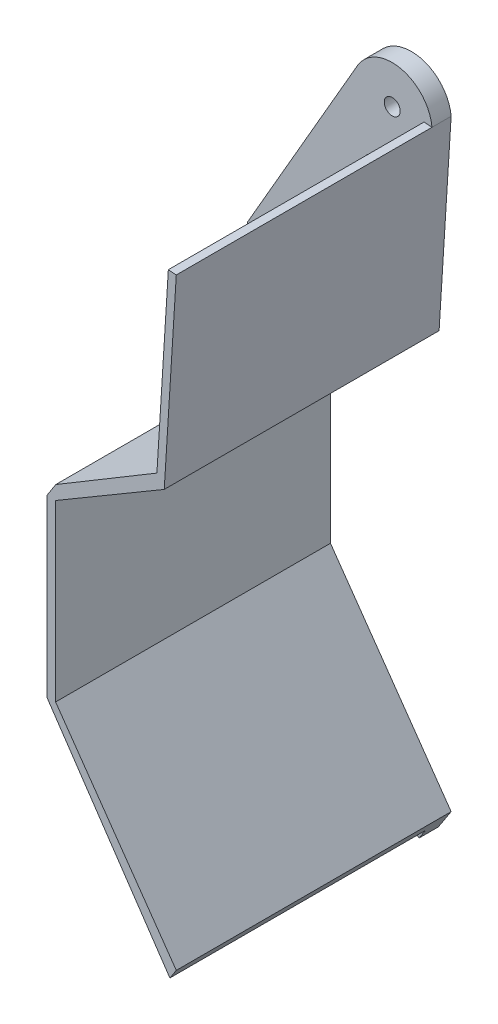
ISO-10303-21;
HEADER;
FILE_DESCRIPTION(('STEP AP214'),'2;1');
FILE_NAME('part.step','',(''),(''),'','','');
FILE_SCHEMA(('AUTOMOTIVE_DESIGN { 1 0 10303 214 1 1 1 1 }'));
ENDSEC;
DATA;
#1=APPLICATION_CONTEXT('core data for automotive mechanical design processes');
#2=APPLICATION_PROTOCOL_DEFINITION('international standard','automotive_design',2000,#1);
#3=PRODUCT_CONTEXT('',#1,'mechanical');
#4=PRODUCT('Part','Part','',(#3));
#5=PRODUCT_RELATED_PRODUCT_CATEGORY('part','',(#4));
#6=PRODUCT_DEFINITION_FORMATION('','',#4);
#7=PRODUCT_DEFINITION_CONTEXT('part definition',#1,'design');
#8=PRODUCT_DEFINITION('design','',#6,#7);
#9=PRODUCT_DEFINITION_SHAPE('','',#8);
#10=(LENGTH_UNIT() NAMED_UNIT(*) SI_UNIT(.MILLI.,.METRE.));
#11=(NAMED_UNIT(*) PLANE_ANGLE_UNIT() SI_UNIT($,.RADIAN.));
#12=(NAMED_UNIT(*) SI_UNIT($,.STERADIAN.) SOLID_ANGLE_UNIT());
#13=UNCERTAINTY_MEASURE_WITH_UNIT(LENGTH_MEASURE(1.E-05),#10,'distance_accuracy_value','');
#14=(GEOMETRIC_REPRESENTATION_CONTEXT(3) GLOBAL_UNCERTAINTY_ASSIGNED_CONTEXT((#13)) GLOBAL_UNIT_ASSIGNED_CONTEXT((#10,
#11,#12)) REPRESENTATION_CONTEXT('',''));
#15=CARTESIAN_POINT('',(0.,0.,0.));
#16=DIRECTION('',(0.,0.,1.));
#17=DIRECTION('',(1.,0.,0.));
#18=AXIS2_PLACEMENT_3D('',#15,#16,#17);
#19=CARTESIAN_POINT('',(0.,0.,3.));
#20=DIRECTION('',(0.,0.,1.));
#21=DIRECTION('',(1.,0.,0.));
#22=AXIS2_PLACEMENT_3D('',#19,#20,#21);
#23=PLANE('',#22);
#24=CARTESIAN_POINT('',(2.59169776383635,54.4046006028755,3.));
#25=DIRECTION('',(0.,0.,1.));
#26=DIRECTION('',(1.,0.,0.));
#27=AXIS2_PLACEMENT_3D('',#24,#25,#26);
#28=CIRCLE('',#27,1.25);
#29=CARTESIAN_POINT('',(3.84169776383635,54.4046006028755,3.));
#30=VERTEX_POINT('',#29);
#31=EDGE_CURVE('E330',#30,#30,#28,.T.);
#32=ORIENTED_EDGE('',*,*,#31,.F.);
#33=EDGE_LOOP('',(#32));
#34=FACE_BOUND('',#33,.T.);
#35=CARTESIAN_POINT('',(5.7844226517787,63.8812301614218,3.));
#36=DIRECTION('',(0.,0.,1.));
#37=DIRECTION('',(1.,0.,0.));
#38=AXIS2_PLACEMENT_3D('',#35,#36,#37);
#39=CIRCLE('',#38,1.25);
#40=CARTESIAN_POINT('',(7.0344226517787,63.8812301614218,3.));
#41=VERTEX_POINT('',#40);
#42=EDGE_CURVE('E341',#41,#41,#39,.T.);
#43=ORIENTED_EDGE('',*,*,#42,.F.);
#44=EDGE_LOOP('',(#43));
#45=FACE_BOUND('',#44,.T.);
#46=DIRECTION('',(-0.0627724838499412,-0.998027862973429,0.));
#47=VECTOR('',#46,1.);
#48=CARTESIAN_POINT('',(8.96652668410229,35.8285484730478,3.));
#49=LINE('',#48,#47);
#50=CARTESIAN_POINT('',(10.7560941355182,64.2811135085977,3.));
#51=VERTEX_POINT('',#50);
#52=CARTESIAN_POINT('',(8.96652668410229,35.8285484730478,3.));
#53=VERTEX_POINT('',#52);
#54=EDGE_CURVE('E52',#51,#53,#49,.T.);
#55=ORIENTED_EDGE('',*,*,#54,.F.);
#56=DIRECTION('',(-0.997367941462807,0.0725064779329624,0.));
#57=VECTOR('',#56,1.);
#58=CARTESIAN_POINT('',(10.7560941355182,64.2811135085977,3.));
#59=LINE('',#58,#57);
#60=CARTESIAN_POINT('',(11.9997557720586,64.1907020152488,3.));
#61=VERTEX_POINT('',#60);
#62=EDGE_CURVE('E328',#61,#51,#59,.T.);
#63=ORIENTED_EDGE('',*,*,#62,.F.);
#64=CARTESIAN_POINT('',(5.76690652211303,63.6033246271349,3.));
#65=DIRECTION('',(0.,0.,1.));
#66=DIRECTION('',(1.,0.,0.));
#67=AXIS2_PLACEMENT_3D('',#64,#65,#66);
#68=CIRCLE('',#67,6.26046499619758);
#69=CARTESIAN_POINT('',(0.441332655320446,66.8944771544346,3.));
#70=VERTEX_POINT('',#69);
#71=EDGE_CURVE('E225',#70,#61,#68,.F.);
#72=ORIENTED_EDGE('',*,*,#71,.F.);
#73=DIRECTION('',(-0.500000000000001,-0.866025403784438,0.));
#74=VECTOR('',#73,1.);
#75=CARTESIAN_POINT('',(-28.6351588028188,16.5325166430951,3.));
#76=LINE('',#75,#74);
#77=CARTESIAN_POINT('',(-16.8791754203684,36.8944771544346,3.));
#78=VERTEX_POINT('',#77);
#79=EDGE_CURVE('E228',#70,#78,#76,.T.);
#80=ORIENTED_EDGE('',*,*,#79,.T.);
#81=DIRECTION('',(0.,-1.,0.));
#82=VECTOR('',#81,1.);
#83=CARTESIAN_POINT('',(-16.8791754203684,0.,3.));
#84=LINE('',#83,#82);
#85=CARTESIAN_POINT('',(-16.8791754203684,-3.10552284556541,3.));
#86=VERTEX_POINT('',#85);
#87=EDGE_CURVE('E231',#78,#86,#84,.T.);
#88=ORIENTED_EDGE('',*,*,#87,.T.);
#89=DIRECTION('',(0.500000000000001,-0.866025403784438,0.));
#90=VECTOR('',#89,1.);
#91=CARTESIAN_POINT('',(-14.0041124034225,-8.08527806587781,3.));
#92=LINE('',#91,#90);
#93=CARTESIAN_POINT('',(-5.3321700365758,-23.1055228455654,3.));
#94=VERTEX_POINT('',#93);
#95=EDGE_CURVE('E233',#86,#94,#92,.T.);
#96=ORIENTED_EDGE('',*,*,#95,.T.);
#97=DIRECTION('',(0.837473233252394,-0.546478346859033,0.));
#98=VECTOR('',#97,1.);
#99=CARTESIAN_POINT('',(-12.166888121993,-18.6456484373278,3.));
#100=LINE('',#99,#98);
#101=CARTESIAN_POINT('',(9.99274151876576,-33.1055228455654,3.));
#102=VERTEX_POINT('',#101);
#103=EDGE_CURVE('E235',#94,#102,#100,.T.);
#104=ORIENTED_EDGE('',*,*,#103,.T.);
#105=DIRECTION('',(-0.546478346859033,-0.837473233252394,0.));
#106=VECTOR('',#105,1.);
#107=CARTESIAN_POINT('',(22.1596296407588,-14.4598744082376,3.));
#108=LINE('',#107,#106);
#109=CARTESIAN_POINT('',(10.9962486454122,-31.5676570494642,3.));
#110=VERTEX_POINT('',#109);
#111=EDGE_CURVE('E238',#110,#102,#108,.T.);
#112=ORIENTED_EDGE('',*,*,#111,.F.);
#113=DIRECTION('',(0.560666801625377,-0.828041507145125,0.));
#114=VECTOR('',#113,1.);
#115=CARTESIAN_POINT('',(-7.11584674073575,-4.81813894419358,3.));
#116=LINE('',#115,#114);
#117=CARTESIAN_POINT('',(-8.24840054145359,-3.14548496619693,3.));
#118=VERTEX_POINT('',#117);
#119=EDGE_CURVE('E215',#118,#110,#116,.T.);
#120=ORIENTED_EDGE('',*,*,#119,.F.);
#121=DIRECTION('',(0.,-1.,0.));
#122=VECTOR('',#121,1.);
#123=CARTESIAN_POINT('',(-8.24840054145359,0.,3.));
#124=LINE('',#123,#122);
#125=CARTESIAN_POINT('',(-8.24840054145359,24.1907020152488,3.));
#126=VERTEX_POINT('',#125);
#127=EDGE_CURVE('E222',#126,#118,#124,.T.);
#128=ORIENTED_EDGE('',*,*,#127,.F.);
#129=DIRECTION('',(-0.539017906216174,-0.842294305322274,0.));
#130=VECTOR('',#129,1.);
#131=CARTESIAN_POINT('',(-8.24840054145359,24.1907020152488,3.));
#132=LINE('',#131,#130);
#133=CARTESIAN_POINT('',(-6.85884455617702,26.3620864531816,3.));
#134=VERTEX_POINT('',#133);
#135=EDGE_CURVE('E59',#134,#126,#132,.T.);
#136=ORIENTED_EDGE('',*,*,#135,.F.);
#137=DIRECTION('',(-0.858180235420516,-0.513348501053219,0.));
#138=VECTOR('',#137,1.);
#139=CARTESIAN_POINT('',(-6.85884455617702,26.3620864531816,3.));
#140=LINE('',#139,#138);
#141=EDGE_CURVE('E186',#53,#134,#140,.T.);
#142=ORIENTED_EDGE('',*,*,#141,.F.);
#143=EDGE_LOOP('',(#55,#63,#72,#80,#88,#96,#104,#112,#120,#128,#136,#142));
#144=FACE_BOUND('',#143,.T.);
#145=ADVANCED_FACE('F37',(#34,#45,#144),#23,.T.);
#146=CARTESIAN_POINT('',(5.76690652211303,63.6033246271349,3.));
#147=DIRECTION('',(0.,0.,-1.));
#148=DIRECTION('',(-1.,0.,0.));
#149=AXIS2_PLACEMENT_3D('',#146,#147,#148);
#150=CYLINDRICAL_SURFACE('',#149,6.26046499619758);
#151=CARTESIAN_POINT('',(5.76690652211303,63.6033246271349,0.));
#152=DIRECTION('',(0.,0.,1.));
#153=DIRECTION('',(1.,0.,0.));
#154=AXIS2_PLACEMENT_3D('',#151,#152,#153);
#155=CIRCLE('',#154,6.26046499619758);
#156=CARTESIAN_POINT('',(0.441332655320446,66.8944771544346,0.));
#157=VERTEX_POINT('',#156);
#158=CARTESIAN_POINT('',(11.9997557720586,64.1907020152488,0.));
#159=VERTEX_POINT('',#158);
#160=EDGE_CURVE('E224',#157,#159,#155,.F.);
#161=ORIENTED_EDGE('',*,*,#160,.F.);
#162=DIRECTION('',(0.,0.,-1.));
#163=VECTOR('',#162,1.);
#164=CARTESIAN_POINT('',(0.441332655320446,66.8944771544346,3.));
#165=LINE('',#164,#163);
#166=EDGE_CURVE('E11',#70,#157,#165,.T.);
#167=ORIENTED_EDGE('',*,*,#166,.F.);
#168=ORIENTED_EDGE('',*,*,#71,.T.);
#169=DIRECTION('',(0.,0.,-1.));
#170=VECTOR('',#169,1.);
#171=CARTESIAN_POINT('',(11.9997557720586,64.1907020152488,3.));
#172=LINE('',#171,#170);
#173=EDGE_CURVE('E166',#61,#159,#172,.T.);
#174=ORIENTED_EDGE('',*,*,#173,.T.);
#175=EDGE_LOOP('',(#161,#167,#168,#174));
#176=FACE_BOUND('',#175,.T.);
#177=ADVANCED_FACE('F39',(#176),#150,.T.);
#178=CARTESIAN_POINT('',(-28.6351588028188,16.5325166430951,3.));
#179=DIRECTION('',(0.866025403784438,-0.500000000000001,0.));
#180=DIRECTION('',(0.500000000000001,0.866025403784438,0.));
#181=AXIS2_PLACEMENT_3D('',#178,#179,#180);
#182=PLANE('',#181);
#183=DIRECTION('',(-0.500000000000001,-0.866025403784438,0.));
#184=VECTOR('',#183,1.);
#185=CARTESIAN_POINT('',(-28.6351588028188,16.5325166430951,0.));
#186=LINE('',#185,#184);
#187=CARTESIAN_POINT('',(-16.8791754203684,36.8944771544346,0.));
#188=VERTEX_POINT('',#187);
#189=EDGE_CURVE('E242',#157,#188,#186,.T.);
#190=ORIENTED_EDGE('',*,*,#189,.T.);
#191=DIRECTION('',(0.,0.,-1.));
#192=VECTOR('',#191,1.);
#193=CARTESIAN_POINT('',(-16.8791754203684,36.8944771544346,3.));
#194=LINE('',#193,#192);
#195=EDGE_CURVE('E45',#78,#188,#194,.T.);
#196=ORIENTED_EDGE('',*,*,#195,.F.);
#197=ORIENTED_EDGE('',*,*,#79,.F.);
#198=ORIENTED_EDGE('',*,*,#166,.T.);
#199=EDGE_LOOP('',(#190,#196,#197,#198));
#200=FACE_BOUND('',#199,.T.);
#201=ADVANCED_FACE('F302',(#200),#182,.F.);
#202=CARTESIAN_POINT('',(-16.8791754203684,0.,3.));
#203=DIRECTION('',(1.,0.,0.));
#204=DIRECTION('',(0.,1.,0.));
#205=AXIS2_PLACEMENT_3D('',#202,#203,#204);
#206=PLANE('',#205);
#207=DIRECTION('',(0.,-1.,0.));
#208=VECTOR('',#207,1.);
#209=CARTESIAN_POINT('',(-16.8791754203684,0.,0.));
#210=LINE('',#209,#208);
#211=CARTESIAN_POINT('',(-16.8791754203684,-3.10552284556541,0.));
#212=VERTEX_POINT('',#211);
#213=EDGE_CURVE('E244',#188,#212,#210,.T.);
#214=ORIENTED_EDGE('',*,*,#213,.T.);
#215=DIRECTION('',(0.,0.,-1.));
#216=VECTOR('',#215,1.);
#217=CARTESIAN_POINT('',(-16.8791754203684,-3.10552284556541,3.));
#218=LINE('',#217,#216);
#219=EDGE_CURVE('E273',#86,#212,#218,.T.);
#220=ORIENTED_EDGE('',*,*,#219,.F.);
#221=ORIENTED_EDGE('',*,*,#87,.F.);
#222=ORIENTED_EDGE('',*,*,#195,.T.);
#223=EDGE_LOOP('',(#214,#220,#221,#222));
#224=FACE_BOUND('',#223,.T.);
#225=ADVANCED_FACE('F280',(#224),#206,.F.);
#226=CARTESIAN_POINT('',(-14.0041124034225,-8.08527806587781,3.));
#227=DIRECTION('',(0.866025403784438,0.500000000000001,0.));
#228=DIRECTION('',(-0.500000000000001,0.866025403784438,0.));
#229=AXIS2_PLACEMENT_3D('',#226,#227,#228);
#230=PLANE('',#229);
#231=DIRECTION('',(0.500000000000001,-0.866025403784438,0.));
#232=VECTOR('',#231,1.);
#233=CARTESIAN_POINT('',(-14.0041124034225,-8.08527806587781,0.));
#234=LINE('',#233,#232);
#235=CARTESIAN_POINT('',(-5.3321700365758,-23.1055228455654,0.));
#236=VERTEX_POINT('',#235);
#237=EDGE_CURVE('E246',#212,#236,#234,.T.);
#238=ORIENTED_EDGE('',*,*,#237,.T.);
#239=DIRECTION('',(0.,0.,-1.));
#240=VECTOR('',#239,1.);
#241=CARTESIAN_POINT('',(-5.3321700365758,-23.1055228455654,3.));
#242=LINE('',#241,#240);
#243=EDGE_CURVE('E270',#94,#236,#242,.T.);
#244=ORIENTED_EDGE('',*,*,#243,.F.);
#245=ORIENTED_EDGE('',*,*,#95,.F.);
#246=ORIENTED_EDGE('',*,*,#219,.T.);
#247=EDGE_LOOP('',(#238,#244,#245,#246));
#248=FACE_BOUND('',#247,.T.);
#249=ADVANCED_FACE('F292',(#248),#230,.F.);
#250=CARTESIAN_POINT('',(-12.166888121993,-18.6456484373278,3.));
#251=DIRECTION('',(0.546478346859033,0.837473233252394,0.));
#252=DIRECTION('',(-0.837473233252394,0.546478346859033,0.));
#253=AXIS2_PLACEMENT_3D('',#250,#251,#252);
#254=PLANE('',#253);
#255=DIRECTION('',(0.837473233252394,-0.546478346859033,0.));
#256=VECTOR('',#255,1.);
#257=CARTESIAN_POINT('',(-12.166888121993,-18.6456484373278,0.));
#258=LINE('',#257,#256);
#259=CARTESIAN_POINT('',(9.99274151876576,-33.1055228455654,0.));
#260=VERTEX_POINT('',#259);
#261=EDGE_CURVE('E248',#236,#260,#258,.T.);
#262=ORIENTED_EDGE('',*,*,#261,.T.);
#263=DIRECTION('',(0.,0.,-1.));
#264=VECTOR('',#263,1.);
#265=CARTESIAN_POINT('',(9.99274151876576,-33.1055228455654,3.));
#266=LINE('',#265,#264);
#267=EDGE_CURVE('E267',#102,#260,#266,.T.);
#268=ORIENTED_EDGE('',*,*,#267,.F.);
#269=ORIENTED_EDGE('',*,*,#103,.F.);
#270=ORIENTED_EDGE('',*,*,#243,.T.);
#271=EDGE_LOOP('',(#262,#268,#269,#270));
#272=FACE_BOUND('',#271,.T.);
#273=ADVANCED_FACE('F296',(#272),#254,.F.);
#274=CARTESIAN_POINT('',(22.1596296407588,-14.4598744082376,3.));
#275=DIRECTION('',(0.837473233252394,-0.546478346859033,0.));
#276=DIRECTION('',(0.546478346859033,0.837473233252394,0.));
#277=AXIS2_PLACEMENT_3D('',#274,#275,#276);
#278=PLANE('',#277);
#279=ORIENTED_EDGE('',*,*,#267,.T.);
#280=DIRECTION('',(-0.546478346859033,-0.837473233252394,0.));
#281=VECTOR('',#280,1.);
#282=CARTESIAN_POINT('',(22.1596296407588,-14.4598744082376,0.));
#283=LINE('',#282,#281);
#284=CARTESIAN_POINT('',(11.9997557720586,-30.0297912533631,0.));
#285=VERTEX_POINT('',#284);
#286=EDGE_CURVE('E251',#285,#260,#283,.T.);
#287=ORIENTED_EDGE('',*,*,#286,.F.);
#288=DIRECTION('',(0.,0.,-1.));
#289=VECTOR('',#288,1.);
#290=CARTESIAN_POINT('',(11.9997557720586,-30.0297912533631,3.));
#291=LINE('',#290,#289);
#292=CARTESIAN_POINT('',(11.9997557720586,-30.0297912533631,43.));
#293=VERTEX_POINT('',#292);
#294=EDGE_CURVE('E265',#293,#285,#291,.T.);
#295=ORIENTED_EDGE('',*,*,#294,.F.);
#296=DIRECTION('',(-0.546478346859031,-0.837473233252395,0.));
#297=VECTOR('',#296,1.);
#298=CARTESIAN_POINT('',(11.9997557720586,-30.0297912533631,43.));
#299=LINE('',#298,#297);
#300=CARTESIAN_POINT('',(10.9962486454122,-31.5676570494642,43.));
#301=VERTEX_POINT('',#300);
#302=EDGE_CURVE('E204',#293,#301,#299,.T.);
#303=ORIENTED_EDGE('',*,*,#302,.T.);
#304=DIRECTION('',(0.,0.,-1.));
#305=VECTOR('',#304,1.);
#306=CARTESIAN_POINT('',(10.9962486454122,-31.5676570494642,43.));
#307=LINE('',#306,#305);
#308=EDGE_CURVE('E212',#301,#110,#307,.T.);
#309=ORIENTED_EDGE('',*,*,#308,.T.);
#310=ORIENTED_EDGE('',*,*,#111,.T.);
#311=EDGE_LOOP('',(#279,#287,#295,#303,#309,#310));
#312=FACE_BOUND('',#311,.T.);
#313=ADVANCED_FACE('F313',(#312),#278,.T.);
#314=CARTESIAN_POINT('',(-6.07156547642134,-4.25729921881468,3.));
#315=DIRECTION('',(0.818775295962723,0.574114112978556,0.));
#316=DIRECTION('',(-0.574114112978556,0.818775295962724,0.));
#317=AXIS2_PLACEMENT_3D('',#314,#315,#316);
#318=PLANE('',#317);
#319=DIRECTION('',(0.574114112978556,-0.818775295962724,0.));
#320=VECTOR('',#319,1.);
#321=CARTESIAN_POINT('',(-6.07156547642134,-4.25729921881468,0.));
#322=LINE('',#321,#320);
#323=CARTESIAN_POINT('',(-6.87917542036836,-3.10552284556541,0.));
#324=VERTEX_POINT('',#323);
#325=EDGE_CURVE('E253',#324,#285,#322,.T.);
#326=ORIENTED_EDGE('',*,*,#325,.F.);
#327=DIRECTION('',(0.,0.,-1.));
#328=VECTOR('',#327,1.);
#329=CARTESIAN_POINT('',(-6.87917542036836,-3.10552284556541,3.));
#330=LINE('',#329,#328);
#331=CARTESIAN_POINT('',(-6.87917542036836,-3.10552284556541,43.));
#332=VERTEX_POINT('',#331);
#333=EDGE_CURVE('E263',#332,#324,#330,.T.);
#334=ORIENTED_EDGE('',*,*,#333,.F.);
#335=DIRECTION('',(0.574114112978556,-0.818775295962724,0.));
#336=VECTOR('',#335,1.);
#337=CARTESIAN_POINT('',(-6.87917542036836,-3.10552284556541,43.));
#338=LINE('',#337,#336);
#339=EDGE_CURVE('E201',#332,#293,#338,.T.);
#340=ORIENTED_EDGE('',*,*,#339,.T.);
#341=ORIENTED_EDGE('',*,*,#294,.T.);
#342=EDGE_LOOP('',(#326,#334,#340,#341));
#343=FACE_BOUND('',#342,.T.);
#344=ADVANCED_FACE('F309',(#343),#318,.T.);
#345=CARTESIAN_POINT('',(-6.87917542036836,0.,3.));
#346=DIRECTION('',(1.,0.,0.));
#347=DIRECTION('',(0.,1.,0.));
#348=AXIS2_PLACEMENT_3D('',#345,#346,#347);
#349=PLANE('',#348);
#350=DIRECTION('',(0.,-1.,0.));
#351=VECTOR('',#350,1.);
#352=CARTESIAN_POINT('',(-6.87917542036836,0.,0.));
#353=LINE('',#352,#351);
#354=CARTESIAN_POINT('',(-6.87917542036836,24.1907020152488,0.));
#355=VERTEX_POINT('',#354);
#356=EDGE_CURVE('E256',#355,#324,#353,.T.);
#357=ORIENTED_EDGE('',*,*,#356,.F.);
#358=DIRECTION('',(0.,0.,-1.));
#359=VECTOR('',#358,1.);
#360=CARTESIAN_POINT('',(-6.87917542036836,24.1907020152488,3.));
#361=LINE('',#360,#359);
#362=CARTESIAN_POINT('',(-6.87917542036836,24.1907020152488,43.));
#363=VERTEX_POINT('',#362);
#364=EDGE_CURVE('E165',#363,#355,#361,.T.);
#365=ORIENTED_EDGE('',*,*,#364,.F.);
#366=DIRECTION('',(0.,-1.,0.));
#367=VECTOR('',#366,1.);
#368=CARTESIAN_POINT('',(-6.87917542036836,24.1907020152488,43.));
#369=LINE('',#368,#367);
#370=EDGE_CURVE('E181',#363,#332,#369,.T.);
#371=ORIENTED_EDGE('',*,*,#370,.T.);
#372=ORIENTED_EDGE('',*,*,#333,.T.);
#373=EDGE_LOOP('',(#357,#365,#371,#372));
#374=FACE_BOUND('',#373,.T.);
#375=ADVANCED_FACE('F307',(#374),#349,.T.);
#376=CARTESIAN_POINT('',(-12.343162824505,20.9753639466543,3.));
#377=DIRECTION('',(0.507164002195062,-0.861849566268666,0.));
#378=DIRECTION('',(0.861849566268666,0.507164002195062,0.));
#379=AXIS2_PLACEMENT_3D('',#376,#377,#378);
#380=PLANE('',#379);
#381=DIRECTION('',(-0.861849566268666,-0.507164002195062,0.));
#382=VECTOR('',#381,1.);
#383=CARTESIAN_POINT('',(-12.343162824505,20.9753639466543,0.));
#384=LINE('',#383,#382);
#385=CARTESIAN_POINT('',(10.1143328439896,34.1907020152488,0.));
#386=VERTEX_POINT('',#385);
#387=EDGE_CURVE('E161',#386,#355,#384,.T.);
#388=ORIENTED_EDGE('',*,*,#387,.F.);
#389=DIRECTION('',(0.,0.,-1.));
#390=VECTOR('',#389,1.);
#391=CARTESIAN_POINT('',(10.1143328439896,34.1907020152488,3.));
#392=LINE('',#391,#390);
#393=CARTESIAN_POINT('',(10.1143328439896,34.1907020152488,43.));
#394=VERTEX_POINT('',#393);
#395=EDGE_CURVE('E155',#394,#386,#392,.T.);
#396=ORIENTED_EDGE('',*,*,#395,.F.);
#397=DIRECTION('',(0.861849566268666,0.507164002195062,0.));
#398=VECTOR('',#397,1.);
#399=CARTESIAN_POINT('',(-6.87917542036836,24.1907020152488,43.));
#400=LINE('',#399,#398);
#401=EDGE_CURVE('E159',#363,#394,#400,.T.);
#402=ORIENTED_EDGE('',*,*,#401,.F.);
#403=ORIENTED_EDGE('',*,*,#364,.T.);
#404=EDGE_LOOP('',(#388,#396,#402,#403));
#405=FACE_BOUND('',#404,.T.);
#406=ADVANCED_FACE('F157',(#405),#380,.T.);
#407=CARTESIAN_POINT('',(7.93419657418711,-0.498643871225965,3.));
#408=DIRECTION('',(0.998030931366063,-0.0627236800306548,0.));
#409=DIRECTION('',(0.0627236800306548,0.998030931366064,0.));
#410=AXIS2_PLACEMENT_3D('',#407,#408,#409);
#411=PLANE('',#410);
#412=DIRECTION('',(-0.0627236800306548,-0.998030931366063,0.));
#413=VECTOR('',#412,1.);
#414=CARTESIAN_POINT('',(7.93419657418711,-0.498643871225965,0.));
#415=LINE('',#414,#413);
#416=EDGE_CURVE('E229',#159,#386,#415,.T.);
#417=ORIENTED_EDGE('',*,*,#416,.F.);
#418=ORIENTED_EDGE('',*,*,#173,.F.);
#419=DIRECTION('',(0.,0.,-1.));
#420=VECTOR('',#419,1.);
#421=CARTESIAN_POINT('',(11.9997557720586,64.1907020152488,43.));
#422=LINE('',#421,#420);
#423=CARTESIAN_POINT('',(11.9997557720586,64.1907020152488,43.));
#424=VERTEX_POINT('',#423);
#425=EDGE_CURVE('E172',#424,#61,#422,.T.);
#426=ORIENTED_EDGE('',*,*,#425,.F.);
#427=DIRECTION('',(0.0627236800306547,0.998030931366063,0.));
#428=VECTOR('',#427,1.);
#429=CARTESIAN_POINT('',(10.1143328439896,34.1907020152488,43.));
#430=LINE('',#429,#428);
#431=EDGE_CURVE('E169',#394,#424,#430,.T.);
#432=ORIENTED_EDGE('',*,*,#431,.F.);
#433=ORIENTED_EDGE('',*,*,#395,.T.);
#434=EDGE_LOOP('',(#417,#418,#426,#432,#433));
#435=FACE_BOUND('',#434,.T.);
#436=ADVANCED_FACE('F170',(#435),#411,.T.);
#437=CARTESIAN_POINT('',(0.,0.,0.));
#438=DIRECTION('',(0.,0.,1.));
#439=DIRECTION('',(1.,0.,0.));
#440=AXIS2_PLACEMENT_3D('',#437,#438,#439);
#441=PLANE('',#440);
#442=CARTESIAN_POINT('',(2.59169776383635,54.4046006028755,0.));
#443=DIRECTION('',(0.,0.,-1.));
#444=DIRECTION('',(-1.,0.,0.));
#445=AXIS2_PLACEMENT_3D('',#442,#443,#444);
#446=CIRCLE('',#445,1.25);
#447=CARTESIAN_POINT('',(1.34169776383635,54.4046006028755,0.));
#448=VERTEX_POINT('',#447);
#449=EDGE_CURVE('E344',#448,#448,#446,.T.);
#450=ORIENTED_EDGE('',*,*,#449,.F.);
#451=EDGE_LOOP('',(#450));
#452=FACE_BOUND('',#451,.T.);
#453=CARTESIAN_POINT('',(5.7844226517787,63.8812301614218,0.));
#454=DIRECTION('',(0.,0.,-1.));
#455=DIRECTION('',(-1.,0.,0.));
#456=AXIS2_PLACEMENT_3D('',#453,#454,#455);
#457=CIRCLE('',#456,1.25);
#458=CARTESIAN_POINT('',(4.5344226517787,63.8812301614218,0.));
#459=VERTEX_POINT('',#458);
#460=EDGE_CURVE('E345',#459,#459,#457,.T.);
#461=ORIENTED_EDGE('',*,*,#460,.F.);
#462=EDGE_LOOP('',(#461));
#463=FACE_BOUND('',#462,.T.);
#464=ORIENTED_EDGE('',*,*,#387,.T.);
#465=ORIENTED_EDGE('',*,*,#356,.T.);
#466=ORIENTED_EDGE('',*,*,#325,.T.);
#467=ORIENTED_EDGE('',*,*,#286,.T.);
#468=ORIENTED_EDGE('',*,*,#261,.F.);
#469=ORIENTED_EDGE('',*,*,#237,.F.);
#470=ORIENTED_EDGE('',*,*,#213,.F.);
#471=ORIENTED_EDGE('',*,*,#189,.F.);
#472=ORIENTED_EDGE('',*,*,#160,.T.);
#473=ORIENTED_EDGE('',*,*,#416,.T.);
#474=EDGE_LOOP('',(#464,#465,#466,#467,#468,#469,#470,#471,#472,#473));
#475=FACE_BOUND('',#474,.T.);
#476=ADVANCED_FACE('F287',(#452,#463,#475),#441,.F.);
#477=CARTESIAN_POINT('',(-8.24840054145359,24.1907020152488,43.));
#478=DIRECTION('',(-1.,0.,0.));
#479=DIRECTION('',(0.,0.,1.));
#480=AXIS2_PLACEMENT_3D('',#477,#478,#479);
#481=PLANE('',#480);
#482=DIRECTION('',(0.,0.,-1.));
#483=VECTOR('',#482,1.);
#484=CARTESIAN_POINT('',(-8.24840054145359,24.1907020152488,43.));
#485=LINE('',#484,#483);
#486=CARTESIAN_POINT('',(-8.24840054145359,24.1907020152488,43.));
#487=VERTEX_POINT('',#486);
#488=EDGE_CURVE('E213',#487,#126,#485,.T.);
#489=ORIENTED_EDGE('',*,*,#488,.T.);
#490=ORIENTED_EDGE('',*,*,#127,.T.);
#491=DIRECTION('',(0.,0.,-1.));
#492=VECTOR('',#491,1.);
#493=CARTESIAN_POINT('',(-8.24840054145359,-3.14548496619693,43.));
#494=LINE('',#493,#492);
#495=CARTESIAN_POINT('',(-8.24840054145359,-3.14548496619693,43.));
#496=VERTEX_POINT('',#495);
#497=EDGE_CURVE('E216',#496,#118,#494,.T.);
#498=ORIENTED_EDGE('',*,*,#497,.F.);
#499=DIRECTION('',(0.,1.,0.));
#500=VECTOR('',#499,1.);
#501=CARTESIAN_POINT('',(-8.24840054145359,24.1907020152488,43.));
#502=LINE('',#501,#500);
#503=EDGE_CURVE('E210',#496,#487,#502,.T.);
#504=ORIENTED_EDGE('',*,*,#503,.T.);
#505=EDGE_LOOP('',(#489,#490,#498,#504));
#506=FACE_BOUND('',#505,.T.);
#507=ADVANCED_FACE('F321',(#506),#481,.T.);
#508=CARTESIAN_POINT('',(-8.24840054145359,-3.14548496619693,43.));
#509=DIRECTION('',(-0.828041507145125,-0.560666801625377,0.));
#510=DIRECTION('',(0.560666801625377,-0.828041507145125,0.));
#511=AXIS2_PLACEMENT_3D('',#508,#509,#510);
#512=PLANE('',#511);
#513=ORIENTED_EDGE('',*,*,#497,.T.);
#514=ORIENTED_EDGE('',*,*,#119,.T.);
#515=ORIENTED_EDGE('',*,*,#308,.F.);
#516=DIRECTION('',(-0.560666801625377,0.828041507145125,0.));
#517=VECTOR('',#516,1.);
#518=CARTESIAN_POINT('',(-8.24840054145359,-3.14548496619693,43.));
#519=LINE('',#518,#517);
#520=EDGE_CURVE('E207',#301,#496,#519,.T.);
#521=ORIENTED_EDGE('',*,*,#520,.T.);
#522=EDGE_LOOP('',(#513,#514,#515,#521));
#523=FACE_BOUND('',#522,.T.);
#524=ADVANCED_FACE('F316',(#523),#512,.T.);
#525=CARTESIAN_POINT('',(0.,0.,43.));
#526=DIRECTION('',(0.,0.,-1.));
#527=DIRECTION('',(-1.,0.,0.));
#528=AXIS2_PLACEMENT_3D('',#525,#526,#527);
#529=PLANE('',#528);
#530=ORIENTED_EDGE('',*,*,#370,.F.);
#531=ORIENTED_EDGE('',*,*,#401,.T.);
#532=ORIENTED_EDGE('',*,*,#431,.T.);
#533=DIRECTION('',(-0.997367941462807,0.0725064779329624,0.));
#534=VECTOR('',#533,1.);
#535=CARTESIAN_POINT('',(10.7560941355182,64.2811135085977,43.));
#536=LINE('',#535,#534);
#537=CARTESIAN_POINT('',(10.7560941355182,64.2811135085977,43.));
#538=VERTEX_POINT('',#537);
#539=EDGE_CURVE('E175',#424,#538,#536,.T.);
#540=ORIENTED_EDGE('',*,*,#539,.T.);
#541=DIRECTION('',(-0.0627724838499412,-0.998027862973429,0.));
#542=VECTOR('',#541,1.);
#543=CARTESIAN_POINT('',(8.96652668410229,35.8285484730478,43.));
#544=LINE('',#543,#542);
#545=CARTESIAN_POINT('',(8.96652668410229,35.8285484730478,43.));
#546=VERTEX_POINT('',#545);
#547=EDGE_CURVE('E334',#538,#546,#544,.T.);
#548=ORIENTED_EDGE('',*,*,#547,.T.);
#549=DIRECTION('',(-0.858180235420516,-0.513348501053219,0.));
#550=VECTOR('',#549,1.);
#551=CARTESIAN_POINT('',(-6.85884455617702,26.3620864531816,43.));
#552=LINE('',#551,#550);
#553=CARTESIAN_POINT('',(-6.85884455617702,26.3620864531816,43.));
#554=VERTEX_POINT('',#553);
#555=EDGE_CURVE('E182',#546,#554,#552,.T.);
#556=ORIENTED_EDGE('',*,*,#555,.T.);
#557=DIRECTION('',(-0.539017906216174,-0.842294305322274,0.));
#558=VECTOR('',#557,1.);
#559=CARTESIAN_POINT('',(-8.24840054145359,24.1907020152488,43.));
#560=LINE('',#559,#558);
#561=EDGE_CURVE('E184',#554,#487,#560,.T.);
#562=ORIENTED_EDGE('',*,*,#561,.T.);
#563=ORIENTED_EDGE('',*,*,#503,.F.);
#564=ORIENTED_EDGE('',*,*,#520,.F.);
#565=ORIENTED_EDGE('',*,*,#302,.F.);
#566=ORIENTED_EDGE('',*,*,#339,.F.);
#567=EDGE_LOOP('',(#530,#531,#532,#540,#548,#556,#562,#563,#564,#565,#566));
#568=FACE_BOUND('',#567,.T.);
#569=ADVANCED_FACE('F178',(#568),#529,.F.);
#570=CARTESIAN_POINT('',(-6.85884455617702,26.3620864531816,43.));
#571=DIRECTION('',(0.513348501053219,-0.858180235420516,0.));
#572=DIRECTION('',(0.858180235420516,0.513348501053219,0.));
#573=AXIS2_PLACEMENT_3D('',#570,#571,#572);
#574=PLANE('',#573);
#575=ORIENTED_EDGE('',*,*,#141,.T.);
#576=DIRECTION('',(0.,0.,-1.));
#577=VECTOR('',#576,1.);
#578=CARTESIAN_POINT('',(-6.85884455617702,26.3620864531816,43.));
#579=LINE('',#578,#577);
#580=EDGE_CURVE('E193',#554,#134,#579,.T.);
#581=ORIENTED_EDGE('',*,*,#580,.F.);
#582=ORIENTED_EDGE('',*,*,#555,.F.);
#583=DIRECTION('',(0.,0.,-1.));
#584=VECTOR('',#583,1.);
#585=CARTESIAN_POINT('',(8.96652668410229,35.8285484730478,43.));
#586=LINE('',#585,#584);
#587=EDGE_CURVE('E197',#546,#53,#586,.T.);
#588=ORIENTED_EDGE('',*,*,#587,.T.);
#589=EDGE_LOOP('',(#575,#581,#582,#588));
#590=FACE_BOUND('',#589,.T.);
#591=ADVANCED_FACE('F327',(#590),#574,.F.);
#592=CARTESIAN_POINT('',(-8.24840054145359,24.1907020152488,43.));
#593=DIRECTION('',(0.842294305322274,-0.539017906216174,0.));
#594=DIRECTION('',(0.539017906216174,0.842294305322274,0.));
#595=AXIS2_PLACEMENT_3D('',#592,#593,#594);
#596=PLANE('',#595);
#597=ORIENTED_EDGE('',*,*,#135,.T.);
#598=ORIENTED_EDGE('',*,*,#488,.F.);
#599=ORIENTED_EDGE('',*,*,#561,.F.);
#600=ORIENTED_EDGE('',*,*,#580,.T.);
#601=EDGE_LOOP('',(#597,#598,#599,#600));
#602=FACE_BOUND('',#601,.T.);
#603=ADVANCED_FACE('F323',(#602),#596,.F.);
#604=CARTESIAN_POINT('',(10.7560941355182,64.2811135085977,43.));
#605=DIRECTION('',(-0.0725064779329624,-0.997367941462807,0.));
#606=DIRECTION('',(0.997367941462807,-0.0725064779329624,0.));
#607=AXIS2_PLACEMENT_3D('',#604,#605,#606);
#608=PLANE('',#607);
#609=ORIENTED_EDGE('',*,*,#62,.T.);
#610=DIRECTION('',(0.,0.,-1.));
#611=VECTOR('',#610,1.);
#612=CARTESIAN_POINT('',(10.7560941355182,64.2811135085977,43.));
#613=LINE('',#612,#611);
#614=EDGE_CURVE('E333',#538,#51,#613,.T.);
#615=ORIENTED_EDGE('',*,*,#614,.F.);
#616=ORIENTED_EDGE('',*,*,#539,.F.);
#617=ORIENTED_EDGE('',*,*,#425,.T.);
#618=EDGE_LOOP('',(#609,#615,#616,#617));
#619=FACE_BOUND('',#618,.T.);
#620=ADVANCED_FACE('F369',(#619),#608,.F.);
#621=CARTESIAN_POINT('',(8.96652668410229,35.8285484730478,43.));
#622=DIRECTION('',(0.998027862973429,-0.0627724838499412,0.));
#623=DIRECTION('',(0.0627724838499412,0.998027862973429,0.));
#624=AXIS2_PLACEMENT_3D('',#621,#622,#623);
#625=PLANE('',#624);
#626=ORIENTED_EDGE('',*,*,#54,.T.);
#627=ORIENTED_EDGE('',*,*,#587,.F.);
#628=ORIENTED_EDGE('',*,*,#547,.F.);
#629=ORIENTED_EDGE('',*,*,#614,.T.);
#630=EDGE_LOOP('',(#626,#627,#628,#629));
#631=FACE_BOUND('',#630,.T.);
#632=ADVANCED_FACE('F360',(#631),#625,.F.);
#633=CARTESIAN_POINT('',(5.7844226517787,63.8812301614218,10.));
#634=DIRECTION('',(0.,0.,-1.));
#635=DIRECTION('',(-1.,0.,0.));
#636=AXIS2_PLACEMENT_3D('',#633,#634,#635);
#637=CYLINDRICAL_SURFACE('',#636,1.25);
#638=ORIENTED_EDGE('',*,*,#42,.T.);
#639=EDGE_LOOP('',(#638));
#640=FACE_BOUND('',#639,.T.);
#641=ORIENTED_EDGE('',*,*,#460,.T.);
#642=EDGE_LOOP('',(#641));
#643=FACE_BOUND('',#642,.T.);
#644=ADVANCED_FACE('F358',(#640,#643),#637,.F.);
#645=CARTESIAN_POINT('',(2.59169776383635,54.4046006028755,10.));
#646=DIRECTION('',(0.,0.,-1.));
#647=DIRECTION('',(-1.,0.,0.));
#648=AXIS2_PLACEMENT_3D('',#645,#646,#647);
#649=CYLINDRICAL_SURFACE('',#648,1.25);
#650=ORIENTED_EDGE('',*,*,#31,.T.);
#651=EDGE_LOOP('',(#650));
#652=FACE_BOUND('',#651,.T.);
#653=ORIENTED_EDGE('',*,*,#449,.T.);
#654=EDGE_LOOP('',(#653));
#655=FACE_BOUND('',#654,.T.);
#656=ADVANCED_FACE('F351',(#652,#655),#649,.F.);
#657=CLOSED_SHELL('',(#145,#177,#201,#225,#249,#273,#313,#344,#375,#406,#436,#476,#507,#524,
#569,#591,#603,#620,#632,#644,#656));
#658=MANIFOLD_SOLID_BREP('B2',#657);
#659=ADVANCED_BREP_SHAPE_REPRESENTATION('',(#18,#658),#14);
#660=SHAPE_DEFINITION_REPRESENTATION(#9,#659);
ENDSEC;
END-ISO-10303-21;
